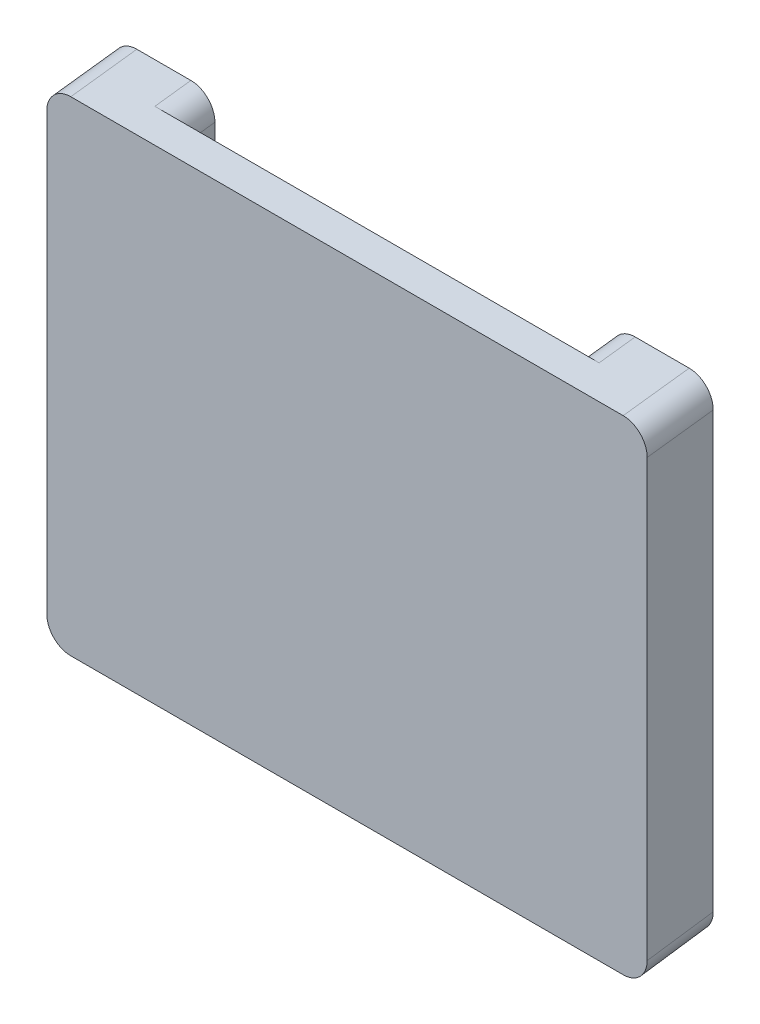
ISO-10303-21;
HEADER;
FILE_DESCRIPTION(('STEP AP214'),'2;1');
FILE_NAME('part.step','',(''),(''),'','','');
FILE_SCHEMA(('AUTOMOTIVE_DESIGN { 1 0 10303 214 1 1 1 1 }'));
ENDSEC;
DATA;
#1=APPLICATION_CONTEXT('core data for automotive mechanical design processes');
#2=APPLICATION_PROTOCOL_DEFINITION('international standard','automotive_design',2000,#1);
#3=PRODUCT_CONTEXT('',#1,'mechanical');
#4=PRODUCT('Part','Part','',(#3));
#5=PRODUCT_RELATED_PRODUCT_CATEGORY('part','',(#4));
#6=PRODUCT_DEFINITION_FORMATION('','',#4);
#7=PRODUCT_DEFINITION_CONTEXT('part definition',#1,'design');
#8=PRODUCT_DEFINITION('design','',#6,#7);
#9=PRODUCT_DEFINITION_SHAPE('','',#8);
#10=(LENGTH_UNIT() NAMED_UNIT(*) SI_UNIT(.MILLI.,.METRE.));
#11=(NAMED_UNIT(*) PLANE_ANGLE_UNIT() SI_UNIT($,.RADIAN.));
#12=(NAMED_UNIT(*) SI_UNIT($,.STERADIAN.) SOLID_ANGLE_UNIT());
#13=UNCERTAINTY_MEASURE_WITH_UNIT(LENGTH_MEASURE(1.E-05),#10,'distance_accuracy_value','');
#14=(GEOMETRIC_REPRESENTATION_CONTEXT(3) GLOBAL_UNCERTAINTY_ASSIGNED_CONTEXT((#13)) GLOBAL_UNIT_ASSIGNED_CONTEXT((#10,
#11,#12)) REPRESENTATION_CONTEXT('',''));
#15=CARTESIAN_POINT('',(0.,0.,0.));
#16=DIRECTION('',(0.,0.,1.));
#17=DIRECTION('',(1.,0.,0.));
#18=AXIS2_PLACEMENT_3D('',#15,#16,#17);
#19=CARTESIAN_POINT('',(-1.65,1.3,-0.55));
#20=DIRECTION('',(-1.,0.,0.));
#21=DIRECTION('',(0.,-1.,0.));
#22=AXIS2_PLACEMENT_3D('',#19,#20,#21);
#23=PLANE('',#22);
#24=DIRECTION('',(0.,0.,-1.));
#25=VECTOR('',#24,1.);
#26=CARTESIAN_POINT('',(-1.65,-0.7,-0.55));
#27=LINE('',#26,#25);
#28=CARTESIAN_POINT('',(-1.65,-0.7,-0.25));
#29=VERTEX_POINT('',#28);
#30=CARTESIAN_POINT('',(-1.65,-0.7,-0.55));
#31=VERTEX_POINT('',#30);
#32=EDGE_CURVE('E215',#29,#31,#27,.T.);
#33=ORIENTED_EDGE('',*,*,#32,.T.);
#34=DIRECTION('',(0.,1.,0.));
#35=VECTOR('',#34,1.);
#36=CARTESIAN_POINT('',(-1.65,0.08864872954314,-0.55));
#37=LINE('',#36,#35);
#38=CARTESIAN_POINT('',(-1.65,1.89849803490822,-0.55));
#39=VERTEX_POINT('',#38);
#40=EDGE_CURVE('E205',#39,#31,#37,.F.);
#41=ORIENTED_EDGE('',*,*,#40,.F.);
#42=DIRECTION('',(0.,0.121869343405567,-0.99254615164127));
#43=VECTOR('',#42,1.);
#44=CARTESIAN_POINT('',(-1.65,1.861662666637,-0.25));
#45=LINE('',#44,#43);
#46=CARTESIAN_POINT('',(-1.65,1.8616626666373,-0.25));
#47=VERTEX_POINT('',#46);
#48=EDGE_CURVE('E217',#47,#39,#45,.T.);
#49=ORIENTED_EDGE('',*,*,#48,.F.);
#50=DIRECTION('',(0.,1.,0.));
#51=VECTOR('',#50,1.);
#52=CARTESIAN_POINT('',(-1.65,3.3,-0.25));
#53=LINE('',#52,#51);
#54=EDGE_CURVE('E185',#47,#29,#53,.F.);
#55=ORIENTED_EDGE('',*,*,#54,.T.);
#56=EDGE_LOOP('',(#33,#41,#49,#55));
#57=FACE_BOUND('',#56,.T.);
#58=ADVANCED_FACE('F17',(#57),#23,.F.);
#59=CARTESIAN_POINT('',(-1.45,-0.7,-0.55));
#60=DIRECTION('',(0.,0.,-1.));
#61=DIRECTION('',(-1.,0.,0.));
#62=AXIS2_PLACEMENT_3D('',#59,#60,#61);
#63=CYLINDRICAL_SURFACE('',#62,0.2);
#64=DIRECTION('',(0.,0.,1.));
#65=VECTOR('',#64,1.);
#66=CARTESIAN_POINT('',(-1.45,-0.9,-0.55));
#67=LINE('',#66,#65);
#68=CARTESIAN_POINT('',(-1.45,-0.9,-0.25));
#69=VERTEX_POINT('',#68);
#70=CARTESIAN_POINT('',(-1.45,-0.9,-0.55));
#71=VERTEX_POINT('',#70);
#72=EDGE_CURVE('E213',#69,#71,#67,.F.);
#73=ORIENTED_EDGE('',*,*,#72,.T.);
#74=CARTESIAN_POINT('',(-1.45,-0.7,-0.55));
#75=DIRECTION('',(0.,0.,-1.));
#76=DIRECTION('',(-1.,0.,0.));
#77=AXIS2_PLACEMENT_3D('',#74,#75,#76);
#78=CIRCLE('',#77,0.2);
#79=EDGE_CURVE('E204',#31,#71,#78,.F.);
#80=ORIENTED_EDGE('',*,*,#79,.F.);
#81=ORIENTED_EDGE('',*,*,#32,.F.);
#82=CARTESIAN_POINT('',(-1.45,-0.7,-0.25));
#83=DIRECTION('',(0.,0.,-1.));
#84=DIRECTION('',(-1.,0.,0.));
#85=AXIS2_PLACEMENT_3D('',#82,#83,#84);
#86=CIRCLE('',#85,0.2);
#87=EDGE_CURVE('E184',#29,#69,#86,.F.);
#88=ORIENTED_EDGE('',*,*,#87,.T.);
#89=EDGE_LOOP('',(#73,#80,#81,#88));
#90=FACE_BOUND('',#89,.T.);
#91=ADVANCED_FACE('F251',(#90),#63,.F.);
#92=CARTESIAN_POINT('',(0.,-0.9,-0.55));
#93=DIRECTION('',(0.,-1.,0.));
#94=DIRECTION('',(1.,0.,0.));
#95=AXIS2_PLACEMENT_3D('',#92,#93,#94);
#96=PLANE('',#95);
#97=DIRECTION('',(-1.,0.,0.));
#98=VECTOR('',#97,1.);
#99=CARTESIAN_POINT('',(2.5,-0.9,-0.55));
#100=LINE('',#99,#98);
#101=CARTESIAN_POINT('',(1.45,-0.9,-0.55));
#102=VERTEX_POINT('',#101);
#103=EDGE_CURVE('E201',#71,#102,#100,.F.);
#104=ORIENTED_EDGE('',*,*,#103,.F.);
#105=ORIENTED_EDGE('',*,*,#72,.F.);
#106=DIRECTION('',(1.,0.,0.));
#107=VECTOR('',#106,1.);
#108=CARTESIAN_POINT('',(-1.65,-0.9,-0.25));
#109=LINE('',#108,#107);
#110=CARTESIAN_POINT('',(1.45,-0.9,-0.25));
#111=VERTEX_POINT('',#110);
#112=EDGE_CURVE('E182',#69,#111,#109,.T.);
#113=ORIENTED_EDGE('',*,*,#112,.T.);
#114=DIRECTION('',(0.,0.,-1.));
#115=VECTOR('',#114,1.);
#116=CARTESIAN_POINT('',(1.45,-0.9,-0.55));
#117=LINE('',#116,#115);
#118=EDGE_CURVE('E211',#111,#102,#117,.T.);
#119=ORIENTED_EDGE('',*,*,#118,.T.);
#120=EDGE_LOOP('',(#104,#105,#113,#119));
#121=FACE_BOUND('',#120,.T.);
#122=ADVANCED_FACE('F256',(#121),#96,.F.);
#123=CARTESIAN_POINT('',(1.45,-0.7,-0.55));
#124=DIRECTION('',(0.,0.,-1.));
#125=DIRECTION('',(-1.,0.,0.));
#126=AXIS2_PLACEMENT_3D('',#123,#124,#125);
#127=CYLINDRICAL_SURFACE('',#126,0.2);
#128=DIRECTION('',(0.,0.,1.));
#129=VECTOR('',#128,1.);
#130=CARTESIAN_POINT('',(1.65,-0.7,-0.55));
#131=LINE('',#130,#129);
#132=CARTESIAN_POINT('',(1.65,-0.7,-0.25));
#133=VERTEX_POINT('',#132);
#134=CARTESIAN_POINT('',(1.65,-0.7,-0.55));
#135=VERTEX_POINT('',#134);
#136=EDGE_CURVE('E134',#133,#135,#131,.F.);
#137=ORIENTED_EDGE('',*,*,#136,.T.);
#138=CARTESIAN_POINT('',(1.45,-0.7,-0.55));
#139=DIRECTION('',(0.,0.,-1.));
#140=DIRECTION('',(-1.,0.,0.));
#141=AXIS2_PLACEMENT_3D('',#138,#139,#140);
#142=CIRCLE('',#141,0.2);
#143=EDGE_CURVE('E200',#102,#135,#142,.F.);
#144=ORIENTED_EDGE('',*,*,#143,.F.);
#145=ORIENTED_EDGE('',*,*,#118,.F.);
#146=CARTESIAN_POINT('',(1.45,-0.7,-0.25));
#147=DIRECTION('',(0.,0.,-1.));
#148=DIRECTION('',(-1.,0.,0.));
#149=AXIS2_PLACEMENT_3D('',#146,#147,#148);
#150=CIRCLE('',#149,0.2);
#151=EDGE_CURVE('E181',#111,#133,#150,.F.);
#152=ORIENTED_EDGE('',*,*,#151,.T.);
#153=EDGE_LOOP('',(#137,#144,#145,#152));
#154=FACE_BOUND('',#153,.T.);
#155=ADVANCED_FACE('F261',(#154),#127,.F.);
#156=CARTESIAN_POINT('',(1.65,1.3,-0.55));
#157=DIRECTION('',(1.,0.,0.));
#158=DIRECTION('',(0.,1.,0.));
#159=AXIS2_PLACEMENT_3D('',#156,#157,#158);
#160=PLANE('',#159);
#161=ORIENTED_EDGE('',*,*,#136,.F.);
#162=DIRECTION('',(0.,1.,0.));
#163=VECTOR('',#162,1.);
#164=CARTESIAN_POINT('',(1.65,3.3,-0.25));
#165=LINE('',#164,#163);
#166=CARTESIAN_POINT('',(1.65,1.86166266663738,-0.25));
#167=VERTEX_POINT('',#166);
#168=EDGE_CURVE('E178',#133,#167,#165,.T.);
#169=ORIENTED_EDGE('',*,*,#168,.T.);
#170=DIRECTION('',(0.,0.121869343405041,-0.992546151641335));
#171=VECTOR('',#170,1.);
#172=CARTESIAN_POINT('',(1.65,1.87866703780257,-0.388489489561053));
#173=LINE('',#172,#171);
#174=CARTESIAN_POINT('',(1.65,1.89849803490822,-0.55));
#175=VERTEX_POINT('',#174);
#176=EDGE_CURVE('E187',#175,#167,#173,.F.);
#177=ORIENTED_EDGE('',*,*,#176,.F.);
#178=DIRECTION('',(0.,1.,0.));
#179=VECTOR('',#178,1.);
#180=CARTESIAN_POINT('',(1.65,0.08864872954314,-0.55));
#181=LINE('',#180,#179);
#182=EDGE_CURVE('E198',#135,#175,#181,.T.);
#183=ORIENTED_EDGE('',*,*,#182,.F.);
#184=EDGE_LOOP('',(#161,#169,#177,#183));
#185=FACE_BOUND('',#184,.T.);
#186=ADVANCED_FACE('F268',(#185),#160,.F.);
#187=CARTESIAN_POINT('',(2.5,0.08864872954314,-0.55));
#188=DIRECTION('',(0.,0.,-1.));
#189=DIRECTION('',(-1.,0.,0.));
#190=AXIS2_PLACEMENT_3D('',#187,#188,#189);
#191=PLANE('',#190);
#192=DIRECTION('',(0.,1.,0.));
#193=VECTOR('',#192,1.);
#194=CARTESIAN_POINT('',(2.5,0.05212279742669,-0.55));
#195=LINE('',#194,#193);
#196=CARTESIAN_POINT('',(2.5,1.89849803490826,-0.55));
#197=VERTEX_POINT('',#196);
#198=CARTESIAN_POINT('',(2.5,-1.72073702641005,-0.55));
#199=VERTEX_POINT('',#198);
#200=EDGE_CURVE('E161',#197,#199,#195,.F.);
#201=ORIENTED_EDGE('',*,*,#200,.T.);
#202=CARTESIAN_POINT('',(2.3,-1.7207370264101,-0.55));
#203=DIRECTION('',(0.,0.,-1.));
#204=DIRECTION('',(0.,-1.,0.));
#205=AXIS2_PLACEMENT_3D('',#202,#203,#204);
#206=ELLIPSE('',#205,0.20196551450372,0.2);
#207=CARTESIAN_POINT('',(2.3,-1.92270254091383,-0.549999999999989));
#208=VERTEX_POINT('',#207);
#209=EDGE_CURVE('E164',#208,#199,#206,.F.);
#210=ORIENTED_EDGE('',*,*,#209,.F.);
#211=DIRECTION('',(1.,0.,0.));
#212=VECTOR('',#211,1.);
#213=CARTESIAN_POINT('',(2.5,-1.92270254091388,-0.549999999999983));
#214=LINE('',#213,#212);
#215=CARTESIAN_POINT('',(-2.3,-1.92270254091376,-0.549999999999991));
#216=VERTEX_POINT('',#215);
#217=EDGE_CURVE('E168',#216,#208,#214,.T.);
#218=ORIENTED_EDGE('',*,*,#217,.F.);
#219=CARTESIAN_POINT('',(-2.3,-1.72073702640991,-0.55));
#220=DIRECTION('',(0.,0.,-1.));
#221=DIRECTION('',(0.,-1.,0.));
#222=AXIS2_PLACEMENT_3D('',#219,#220,#221);
#223=ELLIPSE('',#222,0.20196551450372,0.2);
#224=CARTESIAN_POINT('',(-2.5,-1.72073702640983,-0.55));
#225=VERTEX_POINT('',#224);
#226=EDGE_CURVE('E140',#225,#216,#223,.F.);
#227=ORIENTED_EDGE('',*,*,#226,.F.);
#228=DIRECTION('',(0.,1.,0.));
#229=VECTOR('',#228,1.);
#230=CARTESIAN_POINT('',(-2.5,2.1,-0.55));
#231=LINE('',#230,#229);
#232=CARTESIAN_POINT('',(-2.5,1.89849803490832,-0.55));
#233=VERTEX_POINT('',#232);
#234=EDGE_CURVE('E136',#233,#225,#231,.F.);
#235=ORIENTED_EDGE('',*,*,#234,.F.);
#236=CARTESIAN_POINT('',(-2.3,1.89849803490864,-0.55));
#237=DIRECTION('',(0.,0.,-1.));
#238=DIRECTION('',(0.,1.,0.));
#239=AXIS2_PLACEMENT_3D('',#236,#237,#238);
#240=ELLIPSE('',#239,0.201501965091767,0.2);
#241=CARTESIAN_POINT('',(-2.3,2.1000000000003,-0.549999999999988));
#242=VERTEX_POINT('',#241);
#243=EDGE_CURVE('E20',#233,#242,#240,.T.);
#244=ORIENTED_EDGE('',*,*,#243,.T.);
#245=DIRECTION('',(-1.,0.,0.));
#246=VECTOR('',#245,1.);
#247=CARTESIAN_POINT('',(2.5,2.1,-0.55));
#248=LINE('',#247,#246);
#249=CARTESIAN_POINT('',(-1.85,2.1000000000002,-0.549999999999992));
#250=VERTEX_POINT('',#249);
#251=EDGE_CURVE('E133',#242,#250,#248,.F.);
#252=ORIENTED_EDGE('',*,*,#251,.T.);
#253=CARTESIAN_POINT('',(-1.85,1.89849803490844,-0.55));
#254=DIRECTION('',(0.,0.,-1.));
#255=DIRECTION('',(0.,-1.,0.));
#256=AXIS2_PLACEMENT_3D('',#253,#254,#255);
#257=ELLIPSE('',#256,0.201501965091767,0.2);
#258=EDGE_CURVE('E144',#39,#250,#257,.F.);
#259=ORIENTED_EDGE('',*,*,#258,.F.);
#260=ORIENTED_EDGE('',*,*,#40,.T.);
#261=ORIENTED_EDGE('',*,*,#79,.T.);
#262=ORIENTED_EDGE('',*,*,#103,.T.);
#263=ORIENTED_EDGE('',*,*,#143,.T.);
#264=ORIENTED_EDGE('',*,*,#182,.T.);
#265=CARTESIAN_POINT('',(1.85,1.89849803490844,-0.55));
#266=DIRECTION('',(0.,0.,-1.));
#267=DIRECTION('',(0.,1.,0.));
#268=AXIS2_PLACEMENT_3D('',#265,#266,#267);
#269=ELLIPSE('',#268,0.201501965091767,0.2);
#270=CARTESIAN_POINT('',(1.85,2.1000000000002,-0.549999999999992));
#271=VERTEX_POINT('',#270);
#272=EDGE_CURVE('E192',#271,#175,#269,.F.);
#273=ORIENTED_EDGE('',*,*,#272,.F.);
#274=DIRECTION('',(-1.,0.,0.));
#275=VECTOR('',#274,1.);
#276=CARTESIAN_POINT('',(2.5,2.1,-0.55));
#277=LINE('',#276,#275);
#278=CARTESIAN_POINT('',(2.3,2.10000000000001,-0.55));
#279=VERTEX_POINT('',#278);
#280=EDGE_CURVE('E194',#271,#279,#277,.F.);
#281=ORIENTED_EDGE('',*,*,#280,.T.);
#282=CARTESIAN_POINT('',(2.3,1.89849803490799,-0.55));
#283=DIRECTION('',(0.,0.,-1.));
#284=DIRECTION('',(0.,1.,0.));
#285=AXIS2_PLACEMENT_3D('',#282,#283,#284);
#286=ELLIPSE('',#285,0.201501965091767,0.2);
#287=EDGE_CURVE('E197',#279,#197,#286,.T.);
#288=ORIENTED_EDGE('',*,*,#287,.T.);
#289=EDGE_LOOP('',(#201,#210,#218,#227,#235,#244,#252,#259,#260,#261,#262,#263,#264,#273,#281,#288));
#290=FACE_BOUND('',#289,.T.);
#291=ADVANCED_FACE('F138',(#290),#191,.T.);
#292=CARTESIAN_POINT('',(1.85,1.878667037803,-0.388489489561));
#293=DIRECTION('',(0.,0.121869343405041,-0.992546151641335));
#294=DIRECTION('',(0.,0.992546151641335,0.121869343405041));
#295=AXIS2_PLACEMENT_3D('',#292,#293,#294);
#296=CYLINDRICAL_SURFACE('',#295,0.2);
#297=ORIENTED_EDGE('',*,*,#176,.T.);
#298=CARTESIAN_POINT('',(1.85,1.8616626666376,-0.25));
#299=DIRECTION('',(0.,0.,1.));
#300=DIRECTION('',(0.,1.,0.));
#301=AXIS2_PLACEMENT_3D('',#298,#299,#300);
#302=ELLIPSE('',#301,0.201501965091767,0.2);
#303=CARTESIAN_POINT('',(1.85,2.0631646317294,-0.249999999999974));
#304=VERTEX_POINT('',#303);
#305=EDGE_CURVE('E180',#167,#304,#302,.F.);
#306=ORIENTED_EDGE('',*,*,#305,.T.);
#307=DIRECTION('',(0.,-0.121869343405041,0.992546151641335));
#308=VECTOR('',#307,1.);
#309=CARTESIAN_POINT('',(1.85,2.066234245752,-0.275));
#310=LINE('',#309,#308);
#311=EDGE_CURVE('E160',#271,#304,#310,.T.);
#312=ORIENTED_EDGE('',*,*,#311,.F.);
#313=ORIENTED_EDGE('',*,*,#272,.T.);
#314=EDGE_LOOP('',(#297,#306,#312,#313));
#315=FACE_BOUND('',#314,.T.);
#316=ADVANCED_FACE('F272',(#315),#296,.T.);
#317=CARTESIAN_POINT('',(-1.65,3.3,-0.25));
#318=DIRECTION('',(0.,0.,1.));
#319=DIRECTION('',(1.,0.,0.));
#320=AXIS2_PLACEMENT_3D('',#317,#318,#319);
#321=PLANE('',#320);
#322=ORIENTED_EDGE('',*,*,#168,.F.);
#323=ORIENTED_EDGE('',*,*,#151,.F.);
#324=ORIENTED_EDGE('',*,*,#112,.F.);
#325=ORIENTED_EDGE('',*,*,#87,.F.);
#326=ORIENTED_EDGE('',*,*,#54,.F.);
#327=CARTESIAN_POINT('',(-1.85,1.8616626666376,-0.25));
#328=DIRECTION('',(0.,0.,1.));
#329=DIRECTION('',(0.,-1.,0.));
#330=AXIS2_PLACEMENT_3D('',#327,#328,#329);
#331=ELLIPSE('',#330,0.201501965091767,0.2);
#332=CARTESIAN_POINT('',(-1.85,2.0631646317294,-0.249999999999974));
#333=VERTEX_POINT('',#332);
#334=EDGE_CURVE('E234',#333,#47,#331,.F.);
#335=ORIENTED_EDGE('',*,*,#334,.F.);
#336=DIRECTION('',(1.,0.,0.));
#337=VECTOR('',#336,1.);
#338=CARTESIAN_POINT('',(2.5,2.06316463172942,-0.249999999999948));
#339=LINE('',#338,#337);
#340=EDGE_CURVE('E173',#304,#333,#339,.F.);
#341=ORIENTED_EDGE('',*,*,#340,.F.);
#342=ORIENTED_EDGE('',*,*,#305,.F.);
#343=EDGE_LOOP('',(#322,#323,#324,#325,#326,#335,#341,#342));
#344=FACE_BOUND('',#343,.T.);
#345=ADVANCED_FACE('F400',(#344),#321,.F.);
#346=CARTESIAN_POINT('',(-1.85,1.878667037803,-0.388489489561));
#347=DIRECTION('',(0.,-0.121869343405041,0.992546151641335));
#348=DIRECTION('',(0.,-0.992546151641335,-0.121869343405041));
#349=AXIS2_PLACEMENT_3D('',#346,#347,#348);
#350=CYLINDRICAL_SURFACE('',#349,0.2);
#351=ORIENTED_EDGE('',*,*,#48,.T.);
#352=ORIENTED_EDGE('',*,*,#258,.T.);
#353=DIRECTION('',(0.,-0.121869343405041,0.992546151641335));
#354=VECTOR('',#353,1.);
#355=CARTESIAN_POINT('',(-1.85,2.066234245752,-0.275));
#356=LINE('',#355,#354);
#357=EDGE_CURVE('E153',#333,#250,#356,.F.);
#358=ORIENTED_EDGE('',*,*,#357,.F.);
#359=ORIENTED_EDGE('',*,*,#334,.T.);
#360=EDGE_LOOP('',(#351,#352,#358,#359));
#361=FACE_BOUND('',#360,.T.);
#362=ADVANCED_FACE('F391',(#361),#350,.T.);
#363=CARTESIAN_POINT('',(-2.5,2.1,-0.55));
#364=DIRECTION('',(-1.,0.,0.));
#365=DIRECTION('',(0.,0.,1.));
#366=AXIS2_PLACEMENT_3D('',#363,#364,#365);
#367=PLANE('',#366);
#368=DIRECTION('',(0.,-0.139173100959942,0.990268068741588));
#369=VECTOR('',#368,1.);
#370=CARTESIAN_POINT('',(-2.5,-1.70501512339184,-0.661867152711978));
#371=LINE('',#370,#369);
#372=CARTESIAN_POINT('',(-2.5,-1.79803448549608,0.));
#373=VERTEX_POINT('',#372);
#374=EDGE_CURVE('E143',#373,#225,#371,.F.);
#375=ORIENTED_EDGE('',*,*,#374,.F.);
#376=DIRECTION('',(0.,1.,0.));
#377=VECTOR('',#376,1.);
#378=CARTESIAN_POINT('',(-2.5,0.01623424575168,0.));
#379=LINE('',#378,#377);
#380=CARTESIAN_POINT('',(-2.5,1.83096652641178,0.));
#381=VERTEX_POINT('',#380);
#382=EDGE_CURVE('E148',#381,#373,#379,.F.);
#383=ORIENTED_EDGE('',*,*,#382,.F.);
#384=DIRECTION('',(0.,0.121869343405041,-0.992546151641335));
#385=VECTOR('',#384,1.);
#386=CARTESIAN_POINT('',(-2.5,1.88460789254737,-0.436873868681077));
#387=LINE('',#386,#385);
#388=EDGE_CURVE('E131',#233,#381,#387,.F.);
#389=ORIENTED_EDGE('',*,*,#388,.F.);
#390=ORIENTED_EDGE('',*,*,#234,.T.);
#391=EDGE_LOOP('',(#375,#383,#389,#390));
#392=FACE_BOUND('',#391,.T.);
#393=ADVANCED_FACE('F146',(#392),#367,.T.);
#394=CARTESIAN_POINT('',(-2.3,-1.705015123392,-0.661867152712));
#395=DIRECTION('',(0.,-0.139173100959942,0.990268068741588));
#396=DIRECTION('',(0.,-0.990268068741588,-0.139173100959942));
#397=AXIS2_PLACEMENT_3D('',#394,#395,#396);
#398=CYLINDRICAL_SURFACE('',#397,0.2);
#399=DIRECTION('',(0.,0.139173100959942,-0.990268068741588));
#400=VECTOR('',#399,1.);
#401=CARTESIAN_POINT('',(-2.3,-1.961351270457,-0.275));
#402=LINE('',#401,#400);
#403=CARTESIAN_POINT('',(-2.3,-2.,0.));
#404=VERTEX_POINT('',#403);
#405=EDGE_CURVE('E169',#404,#216,#402,.T.);
#406=ORIENTED_EDGE('',*,*,#405,.F.);
#407=CARTESIAN_POINT('',(-2.3,-1.79803448549616,0.));
#408=DIRECTION('',(0.,0.,1.));
#409=DIRECTION('',(0.,-1.,0.));
#410=AXIS2_PLACEMENT_3D('',#407,#408,#409);
#411=ELLIPSE('',#410,0.20196551450372,0.2);
#412=EDGE_CURVE('E227',#373,#404,#411,.T.);
#413=ORIENTED_EDGE('',*,*,#412,.F.);
#414=ORIENTED_EDGE('',*,*,#374,.T.);
#415=ORIENTED_EDGE('',*,*,#226,.T.);
#416=EDGE_LOOP('',(#406,#413,#414,#415));
#417=FACE_BOUND('',#416,.T.);
#418=ADVANCED_FACE('F296',(#417),#398,.T.);
#419=CARTESIAN_POINT('',(2.5,-1.961351270457,-0.275));
#420=DIRECTION('',(0.,-0.990268068741588,-0.139173100959942));
#421=DIRECTION('',(0.,0.139173100959942,-0.990268068741588));
#422=AXIS2_PLACEMENT_3D('',#419,#420,#421);
#423=PLANE('',#422);
#424=ORIENTED_EDGE('',*,*,#405,.T.);
#425=ORIENTED_EDGE('',*,*,#217,.T.);
#426=DIRECTION('',(0.,-0.139173100959942,0.990268068741588));
#427=VECTOR('',#426,1.);
#428=CARTESIAN_POINT('',(2.3,-1.94187182106532,-0.413603484409988));
#429=LINE('',#428,#427);
#430=CARTESIAN_POINT('',(2.3,-2.00000000000005,0.));
#431=VERTEX_POINT('',#430);
#432=EDGE_CURVE('E165',#431,#208,#429,.F.);
#433=ORIENTED_EDGE('',*,*,#432,.F.);
#434=DIRECTION('',(1.,0.,0.));
#435=VECTOR('',#434,1.);
#436=CARTESIAN_POINT('',(2.5,-2.,0.));
#437=LINE('',#436,#435);
#438=EDGE_CURVE('E226',#404,#431,#437,.T.);
#439=ORIENTED_EDGE('',*,*,#438,.F.);
#440=EDGE_LOOP('',(#424,#425,#433,#439));
#441=FACE_BOUND('',#440,.T.);
#442=ADVANCED_FACE('F298',(#441),#423,.T.);
#443=CARTESIAN_POINT('',(2.3,-1.743818207317,-0.385768864218));
#444=DIRECTION('',(0.,-0.139173100959942,0.990268068741588));
#445=DIRECTION('',(0.,-0.990268068741588,-0.139173100959942));
#446=AXIS2_PLACEMENT_3D('',#443,#444,#445);
#447=CYLINDRICAL_SURFACE('',#446,0.2);
#448=ORIENTED_EDGE('',*,*,#432,.T.);
#449=ORIENTED_EDGE('',*,*,#209,.T.);
#450=DIRECTION('',(0.,-0.139173100959504,0.990268068741649));
#451=VECTOR('',#450,1.);
#452=CARTESIAN_POINT('',(2.5,-1.72073702641,-0.55));
#453=LINE('',#452,#451);
#454=CARTESIAN_POINT('',(2.5,-1.79803448549617,0.));
#455=VERTEX_POINT('',#454);
#456=EDGE_CURVE('E162',#199,#455,#453,.T.);
#457=ORIENTED_EDGE('',*,*,#456,.T.);
#458=CARTESIAN_POINT('',(2.3,-1.79803448549635,0.));
#459=DIRECTION('',(0.,0.,1.));
#460=DIRECTION('',(0.,-1.,0.));
#461=AXIS2_PLACEMENT_3D('',#458,#459,#460);
#462=ELLIPSE('',#461,0.20196551450372,0.2);
#463=EDGE_CURVE('E223',#431,#455,#462,.T.);
#464=ORIENTED_EDGE('',*,*,#463,.F.);
#465=EDGE_LOOP('',(#448,#449,#457,#464));
#466=FACE_BOUND('',#465,.T.);
#467=ADVANCED_FACE('F300',(#466),#447,.T.);
#468=CARTESIAN_POINT('',(2.5,0.05212279742669,-0.274706958823));
#469=DIRECTION('',(-1.,0.,0.));
#470=DIRECTION('',(0.,0.,1.));
#471=AXIS2_PLACEMENT_3D('',#468,#469,#470);
#472=PLANE('',#471);
#473=DIRECTION('',(0.,0.121869343405041,-0.992546151641335));
#474=VECTOR('',#473,1.);
#475=CARTESIAN_POINT('',(2.5,1.85275036271155,-0.177415109353933));
#476=LINE('',#475,#474);
#477=CARTESIAN_POINT('',(2.5,1.83096652641172,0.));
#478=VERTEX_POINT('',#477);
#479=EDGE_CURVE('E157',#478,#197,#476,.T.);
#480=ORIENTED_EDGE('',*,*,#479,.F.);
#481=DIRECTION('',(0.,1.,0.));
#482=VECTOR('',#481,1.);
#483=CARTESIAN_POINT('',(2.5,0.01623424575168,0.));
#484=LINE('',#483,#482);
#485=EDGE_CURVE('E222',#455,#478,#484,.T.);
#486=ORIENTED_EDGE('',*,*,#485,.F.);
#487=ORIENTED_EDGE('',*,*,#456,.F.);
#488=ORIENTED_EDGE('',*,*,#200,.F.);
#489=EDGE_LOOP('',(#480,#486,#487,#488));
#490=FACE_BOUND('',#489,.T.);
#491=ADVANCED_FACE('F280',(#490),#472,.F.);
#492=CARTESIAN_POINT('',(2.3,1.852750362711,-0.177415109354));
#493=DIRECTION('',(0.,0.121869343405041,-0.992546151641335));
#494=DIRECTION('',(0.,0.992546151641335,0.121869343405041));
#495=AXIS2_PLACEMENT_3D('',#492,#493,#494);
#496=CYLINDRICAL_SURFACE('',#495,0.2);
#497=ORIENTED_EDGE('',*,*,#479,.T.);
#498=ORIENTED_EDGE('',*,*,#287,.F.);
#499=DIRECTION('',(0.,-0.121869343405041,0.992546151641335));
#500=VECTOR('',#499,1.);
#501=CARTESIAN_POINT('',(2.3,2.066234245752,-0.275));
#502=LINE('',#501,#500);
#503=CARTESIAN_POINT('',(2.3,2.03246849150347,0.));
#504=VERTEX_POINT('',#503);
#505=EDGE_CURVE('E149',#504,#279,#502,.F.);
#506=ORIENTED_EDGE('',*,*,#505,.F.);
#507=CARTESIAN_POINT('',(2.3,1.83096652641145,0.));
#508=DIRECTION('',(0.,0.,1.));
#509=DIRECTION('',(0.,1.,0.));
#510=AXIS2_PLACEMENT_3D('',#507,#508,#509);
#511=ELLIPSE('',#510,0.201501965091767,0.2);
#512=EDGE_CURVE('E219',#478,#504,#511,.T.);
#513=ORIENTED_EDGE('',*,*,#512,.F.);
#514=EDGE_LOOP('',(#497,#498,#506,#513));
#515=FACE_BOUND('',#514,.T.);
#516=ADVANCED_FACE('F283',(#515),#496,.T.);
#517=CARTESIAN_POINT('',(2.5,2.066234245752,-0.275));
#518=DIRECTION('',(0.,0.992546151641335,0.121869343405041));
#519=DIRECTION('',(0.,-0.121869343405041,0.992546151641335));
#520=AXIS2_PLACEMENT_3D('',#517,#518,#519);
#521=PLANE('',#520);
#522=ORIENTED_EDGE('',*,*,#505,.T.);
#523=ORIENTED_EDGE('',*,*,#280,.F.);
#524=ORIENTED_EDGE('',*,*,#311,.T.);
#525=ORIENTED_EDGE('',*,*,#340,.T.);
#526=ORIENTED_EDGE('',*,*,#357,.T.);
#527=ORIENTED_EDGE('',*,*,#251,.F.);
#528=DIRECTION('',(0.,0.121869343405041,-0.992546151641335));
#529=VECTOR('',#528,1.);
#530=CARTESIAN_POINT('',(-2.3,2.08311712287627,-0.412499999999992));
#531=LINE('',#530,#529);
#532=CARTESIAN_POINT('',(-2.3,2.03246849150364,0.));
#533=VERTEX_POINT('',#532);
#534=EDGE_CURVE('E35',#533,#242,#531,.T.);
#535=ORIENTED_EDGE('',*,*,#534,.F.);
#536=DIRECTION('',(1.,0.,0.));
#537=VECTOR('',#536,1.);
#538=CARTESIAN_POINT('',(2.5,2.032468491503,0.));
#539=LINE('',#538,#537);
#540=EDGE_CURVE('E26',#504,#533,#539,.F.);
#541=ORIENTED_EDGE('',*,*,#540,.F.);
#542=EDGE_LOOP('',(#522,#523,#524,#525,#526,#527,#535,#541));
#543=FACE_BOUND('',#542,.T.);
#544=ADVANCED_FACE('F274',(#543),#521,.T.);
#545=CARTESIAN_POINT('',(-2.3,1.884607892548,-0.436873868681));
#546=DIRECTION('',(0.,0.121869343405041,-0.992546151641335));
#547=DIRECTION('',(0.,0.992546151641335,0.121869343405041));
#548=AXIS2_PLACEMENT_3D('',#545,#546,#547);
#549=CYLINDRICAL_SURFACE('',#548,0.2);
#550=ORIENTED_EDGE('',*,*,#534,.T.);
#551=ORIENTED_EDGE('',*,*,#243,.F.);
#552=ORIENTED_EDGE('',*,*,#388,.T.);
#553=CARTESIAN_POINT('',(-2.3,1.8309665264121,0.));
#554=DIRECTION('',(0.,0.,1.));
#555=DIRECTION('',(0.,1.,0.));
#556=AXIS2_PLACEMENT_3D('',#553,#554,#555);
#557=ELLIPSE('',#556,0.201501965091767,0.2);
#558=EDGE_CURVE('E11',#533,#381,#557,.T.);
#559=ORIENTED_EDGE('',*,*,#558,.F.);
#560=EDGE_LOOP('',(#550,#551,#552,#559));
#561=FACE_BOUND('',#560,.T.);
#562=ADVANCED_FACE('F129',(#561),#549,.T.);
#563=CARTESIAN_POINT('',(2.5,0.01623424575168,0.));
#564=DIRECTION('',(0.,0.,1.));
#565=DIRECTION('',(1.,0.,0.));
#566=AXIS2_PLACEMENT_3D('',#563,#564,#565);
#567=PLANE('',#566);
#568=ORIENTED_EDGE('',*,*,#540,.T.);
#569=ORIENTED_EDGE('',*,*,#558,.T.);
#570=ORIENTED_EDGE('',*,*,#382,.T.);
#571=ORIENTED_EDGE('',*,*,#412,.T.);
#572=ORIENTED_EDGE('',*,*,#438,.T.);
#573=ORIENTED_EDGE('',*,*,#463,.T.);
#574=ORIENTED_EDGE('',*,*,#485,.T.);
#575=ORIENTED_EDGE('',*,*,#512,.T.);
#576=EDGE_LOOP('',(#568,#569,#570,#571,#572,#573,#574,#575));
#577=FACE_BOUND('',#576,.T.);
#578=ADVANCED_FACE('F287',(#577),#567,.T.);
#579=CLOSED_SHELL('',(#58,#91,#122,#155,#186,#291,#316,#345,#362,#393,#418,#442,#467,#491,#516,
#544,#562,#578));
#580=MANIFOLD_SOLID_BREP('B1',#579);
#581=ADVANCED_BREP_SHAPE_REPRESENTATION('',(#18,#580),#14);
#582=SHAPE_DEFINITION_REPRESENTATION(#9,#581);
ENDSEC;
END-ISO-10303-21;
